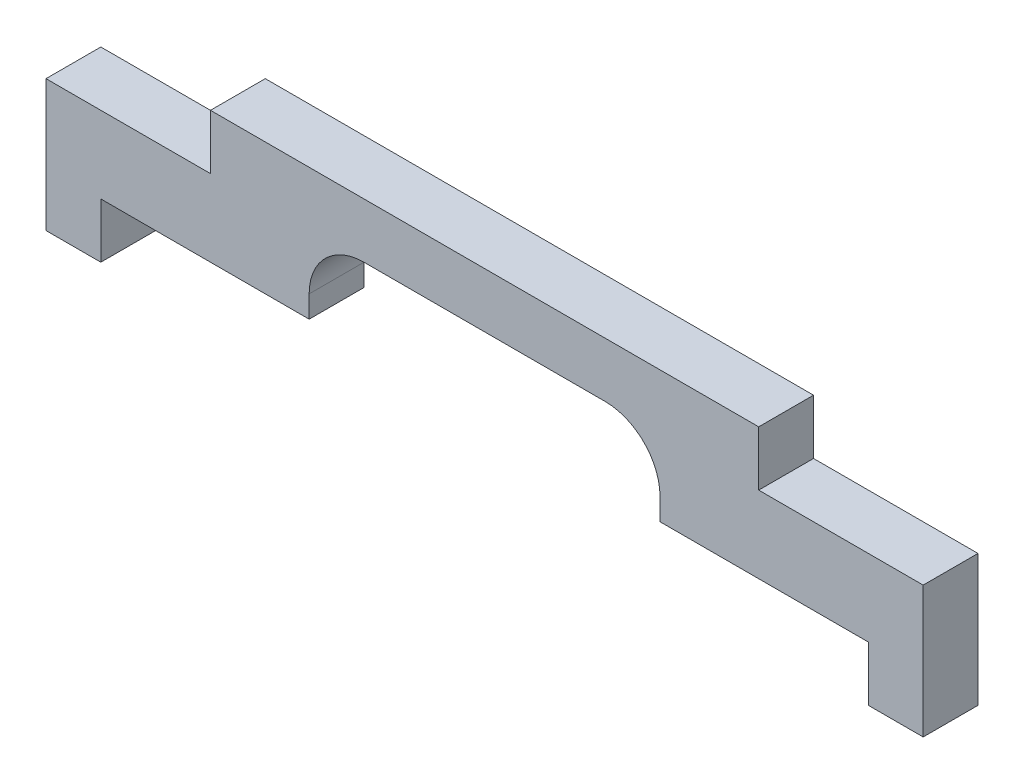
ISO-10303-21;
HEADER;
FILE_DESCRIPTION(('STEP AP214'),'2;1');
FILE_NAME('part.step','',(''),(''),'','','');
FILE_SCHEMA(('AUTOMOTIVE_DESIGN { 1 0 10303 214 1 1 1 1 }'));
ENDSEC;
DATA;
#1=APPLICATION_CONTEXT('core data for automotive mechanical design processes');
#2=APPLICATION_PROTOCOL_DEFINITION('international standard','automotive_design',2000,#1);
#3=PRODUCT_CONTEXT('',#1,'mechanical');
#4=PRODUCT('Part','Part','',(#3));
#5=PRODUCT_RELATED_PRODUCT_CATEGORY('part','',(#4));
#6=PRODUCT_DEFINITION_FORMATION('','',#4);
#7=PRODUCT_DEFINITION_CONTEXT('part definition',#1,'design');
#8=PRODUCT_DEFINITION('design','',#6,#7);
#9=PRODUCT_DEFINITION_SHAPE('','',#8);
#10=(LENGTH_UNIT() NAMED_UNIT(*) SI_UNIT(.MILLI.,.METRE.));
#11=(NAMED_UNIT(*) PLANE_ANGLE_UNIT() SI_UNIT($,.RADIAN.));
#12=(NAMED_UNIT(*) SI_UNIT($,.STERADIAN.) SOLID_ANGLE_UNIT());
#13=UNCERTAINTY_MEASURE_WITH_UNIT(LENGTH_MEASURE(1.E-05),#10,'distance_accuracy_value','');
#14=(GEOMETRIC_REPRESENTATION_CONTEXT(3) GLOBAL_UNCERTAINTY_ASSIGNED_CONTEXT((#13)) GLOBAL_UNIT_ASSIGNED_CONTEXT((#10,
#11,#12)) REPRESENTATION_CONTEXT('',''));
#15=CARTESIAN_POINT('',(0.,0.,0.));
#16=DIRECTION('',(0.,0.,1.));
#17=DIRECTION('',(1.,0.,0.));
#18=AXIS2_PLACEMENT_3D('',#15,#16,#17);
#19=CARTESIAN_POINT('',(-15.9999999999999,-12.,5.));
#20=DIRECTION('',(-1.,0.,0.));
#21=DIRECTION('',(0.,0.,1.));
#22=AXIS2_PLACEMENT_3D('',#19,#20,#21);
#23=PLANE('',#22);
#24=DIRECTION('',(0.,0.,1.));
#25=VECTOR('',#24,1.);
#26=CARTESIAN_POINT('',(-15.9999999999999,-10.,0.));
#27=LINE('',#26,#25);
#28=CARTESIAN_POINT('',(-15.9999999999999,-10.,0.));
#29=VERTEX_POINT('',#28);
#30=CARTESIAN_POINT('',(-15.9999999999999,-10.,5.));
#31=VERTEX_POINT('',#30);
#32=EDGE_CURVE('E174',#29,#31,#27,.T.);
#33=ORIENTED_EDGE('',*,*,#32,.T.);
#34=DIRECTION('',(0.,1.,0.));
#35=VECTOR('',#34,1.);
#36=CARTESIAN_POINT('',(-15.9999999999999,-12.,5.));
#37=LINE('',#36,#35);
#38=CARTESIAN_POINT('',(-15.9999999999999,-12.,5.));
#39=VERTEX_POINT('',#38);
#40=EDGE_CURVE('E207',#39,#31,#37,.T.);
#41=ORIENTED_EDGE('',*,*,#40,.F.);
#42=DIRECTION('',(0.,0.,-1.));
#43=VECTOR('',#42,1.);
#44=CARTESIAN_POINT('',(-15.9999999999999,-12.,5.));
#45=LINE('',#44,#43);
#46=CARTESIAN_POINT('',(-15.9999999999999,-12.,0.));
#47=VERTEX_POINT('',#46);
#48=EDGE_CURVE('E277',#39,#47,#45,.T.);
#49=ORIENTED_EDGE('',*,*,#48,.T.);
#50=DIRECTION('',(0.,1.,0.));
#51=VECTOR('',#50,1.);
#52=CARTESIAN_POINT('',(-15.9999999999999,-12.,0.));
#53=LINE('',#52,#51);
#54=EDGE_CURVE('E240',#47,#29,#53,.T.);
#55=ORIENTED_EDGE('',*,*,#54,.T.);
#56=EDGE_LOOP('',(#33,#41,#49,#55));
#57=FACE_BOUND('',#56,.T.);
#58=ADVANCED_FACE('F33',(#57),#23,.F.);
#59=CARTESIAN_POINT('',(15.9999999999999,-4.99999999999999,5.));
#60=DIRECTION('',(0.,1.,0.));
#61=DIRECTION('',(-1.,0.,0.));
#62=AXIS2_PLACEMENT_3D('',#59,#60,#61);
#63=PLANE('',#62);
#64=DIRECTION('',(1.,0.,0.));
#65=VECTOR('',#64,1.);
#66=CARTESIAN_POINT('',(15.9999999999999,-4.99999999999999,5.));
#67=LINE('',#66,#65);
#68=CARTESIAN_POINT('',(-10.9999999999999,-5.,5.));
#69=VERTEX_POINT('',#68);
#70=CARTESIAN_POINT('',(10.9999999999999,-4.99999999999999,5.));
#71=VERTEX_POINT('',#70);
#72=EDGE_CURVE('E210',#69,#71,#67,.T.);
#73=ORIENTED_EDGE('',*,*,#72,.F.);
#74=DIRECTION('',(0.,0.,1.));
#75=VECTOR('',#74,1.);
#76=CARTESIAN_POINT('',(-10.9999999999999,-5.,0.));
#77=LINE('',#76,#75);
#78=CARTESIAN_POINT('',(-10.9999999999999,-5.,0.));
#79=VERTEX_POINT('',#78);
#80=EDGE_CURVE('E177',#79,#69,#77,.T.);
#81=ORIENTED_EDGE('',*,*,#80,.F.);
#82=DIRECTION('',(1.,0.,0.));
#83=VECTOR('',#82,1.);
#84=CARTESIAN_POINT('',(15.9999999999999,-4.99999999999999,0.));
#85=LINE('',#84,#83);
#86=CARTESIAN_POINT('',(10.9999999999999,-4.99999999999999,0.));
#87=VERTEX_POINT('',#86);
#88=EDGE_CURVE('E167',#79,#87,#85,.T.);
#89=ORIENTED_EDGE('',*,*,#88,.T.);
#90=DIRECTION('',(0.,0.,1.));
#91=VECTOR('',#90,1.);
#92=CARTESIAN_POINT('',(10.9999999999999,-5.,0.));
#93=LINE('',#92,#91);
#94=EDGE_CURVE('E56',#87,#71,#93,.T.);
#95=ORIENTED_EDGE('',*,*,#94,.T.);
#96=EDGE_LOOP('',(#73,#81,#89,#95));
#97=FACE_BOUND('',#96,.T.);
#98=ADVANCED_FACE('F350',(#97),#63,.F.);
#99=CARTESIAN_POINT('',(-25.,0.,5.));
#100=DIRECTION('',(1.,0.,0.));
#101=DIRECTION('',(0.,0.,-1.));
#102=AXIS2_PLACEMENT_3D('',#99,#100,#101);
#103=PLANE('',#102);
#104=DIRECTION('',(0.,-1.,0.));
#105=VECTOR('',#104,1.);
#106=CARTESIAN_POINT('',(-25.,0.,0.));
#107=LINE('',#106,#105);
#108=CARTESIAN_POINT('',(-25.,0.,0.));
#109=VERTEX_POINT('',#108);
#110=CARTESIAN_POINT('',(-25.,-5.,0.));
#111=VERTEX_POINT('',#110);
#112=EDGE_CURVE('E190',#109,#111,#107,.T.);
#113=ORIENTED_EDGE('',*,*,#112,.T.);
#114=DIRECTION('',(0.,0.,-1.));
#115=VECTOR('',#114,1.);
#116=CARTESIAN_POINT('',(-25.,-5.,5.));
#117=LINE('',#116,#115);
#118=CARTESIAN_POINT('',(-25.,-5.,5.));
#119=VERTEX_POINT('',#118);
#120=EDGE_CURVE('E11',#119,#111,#117,.T.);
#121=ORIENTED_EDGE('',*,*,#120,.F.);
#122=DIRECTION('',(0.,-1.,0.));
#123=VECTOR('',#122,1.);
#124=CARTESIAN_POINT('',(-25.,0.,5.));
#125=LINE('',#124,#123);
#126=CARTESIAN_POINT('',(-25.,0.,5.));
#127=VERTEX_POINT('',#126);
#128=EDGE_CURVE('E193',#127,#119,#125,.T.);
#129=ORIENTED_EDGE('',*,*,#128,.F.);
#130=DIRECTION('',(0.,0.,-1.));
#131=VECTOR('',#130,1.);
#132=CARTESIAN_POINT('',(-25.,0.,5.));
#133=LINE('',#132,#131);
#134=EDGE_CURVE('E227',#127,#109,#133,.T.);
#135=ORIENTED_EDGE('',*,*,#134,.T.);
#136=EDGE_LOOP('',(#113,#121,#129,#135));
#137=FACE_BOUND('',#136,.T.);
#138=ADVANCED_FACE('F35',(#137),#103,.F.);
#139=CARTESIAN_POINT('',(-25.,-5.,5.));
#140=DIRECTION('',(0.,-1.,0.));
#141=DIRECTION('',(1.,0.,0.));
#142=AXIS2_PLACEMENT_3D('',#139,#140,#141);
#143=PLANE('',#142);
#144=DIRECTION('',(-1.,0.,0.));
#145=VECTOR('',#144,1.);
#146=CARTESIAN_POINT('',(-25.,-5.,0.));
#147=LINE('',#146,#145);
#148=CARTESIAN_POINT('',(-40.,-5.00000000000001,0.));
#149=VERTEX_POINT('',#148);
#150=EDGE_CURVE('E230',#111,#149,#147,.T.);
#151=ORIENTED_EDGE('',*,*,#150,.T.);
#152=DIRECTION('',(0.,0.,-1.));
#153=VECTOR('',#152,1.);
#154=CARTESIAN_POINT('',(-40.,-5.00000000000001,5.));
#155=LINE('',#154,#153);
#156=CARTESIAN_POINT('',(-40.,-5.00000000000001,5.));
#157=VERTEX_POINT('',#156);
#158=EDGE_CURVE('E41',#157,#149,#155,.T.);
#159=ORIENTED_EDGE('',*,*,#158,.F.);
#160=DIRECTION('',(-1.,0.,0.));
#161=VECTOR('',#160,1.);
#162=CARTESIAN_POINT('',(-25.,-5.,5.));
#163=LINE('',#162,#161);
#164=EDGE_CURVE('E196',#119,#157,#163,.T.);
#165=ORIENTED_EDGE('',*,*,#164,.F.);
#166=ORIENTED_EDGE('',*,*,#120,.T.);
#167=EDGE_LOOP('',(#151,#159,#165,#166));
#168=FACE_BOUND('',#167,.T.);
#169=ADVANCED_FACE('F314',(#168),#143,.F.);
#170=CARTESIAN_POINT('',(-40.,-5.00000000000001,5.));
#171=DIRECTION('',(1.,0.,0.));
#172=DIRECTION('',(0.,0.,-1.));
#173=AXIS2_PLACEMENT_3D('',#170,#171,#172);
#174=PLANE('',#173);
#175=DIRECTION('',(0.,-1.,0.));
#176=VECTOR('',#175,1.);
#177=CARTESIAN_POINT('',(-40.,-5.00000000000001,0.));
#178=LINE('',#177,#176);
#179=CARTESIAN_POINT('',(-40.,-17.0000000000002,0.));
#180=VERTEX_POINT('',#179);
#181=EDGE_CURVE('E232',#149,#180,#178,.T.);
#182=ORIENTED_EDGE('',*,*,#181,.T.);
#183=DIRECTION('',(0.,0.,-1.));
#184=VECTOR('',#183,1.);
#185=CARTESIAN_POINT('',(-40.,-17.0000000000002,5.));
#186=LINE('',#185,#184);
#187=CARTESIAN_POINT('',(-40.,-17.0000000000002,5.));
#188=VERTEX_POINT('',#187);
#189=EDGE_CURVE('E286',#188,#180,#186,.T.);
#190=ORIENTED_EDGE('',*,*,#189,.F.);
#191=DIRECTION('',(0.,-1.,0.));
#192=VECTOR('',#191,1.);
#193=CARTESIAN_POINT('',(-40.,-5.00000000000001,5.));
#194=LINE('',#193,#192);
#195=EDGE_CURVE('E199',#157,#188,#194,.T.);
#196=ORIENTED_EDGE('',*,*,#195,.F.);
#197=ORIENTED_EDGE('',*,*,#158,.T.);
#198=EDGE_LOOP('',(#182,#190,#196,#197));
#199=FACE_BOUND('',#198,.T.);
#200=ADVANCED_FACE('F293',(#199),#174,.F.);
#201=CARTESIAN_POINT('',(-40.,-17.0000000000002,5.));
#202=DIRECTION('',(0.,1.,0.));
#203=DIRECTION('',(-1.,0.,0.));
#204=AXIS2_PLACEMENT_3D('',#201,#202,#203);
#205=PLANE('',#204);
#206=DIRECTION('',(1.,0.,0.));
#207=VECTOR('',#206,1.);
#208=CARTESIAN_POINT('',(-40.,-17.0000000000002,0.));
#209=LINE('',#208,#207);
#210=CARTESIAN_POINT('',(-35.0000000000001,-17.0000000000002,0.));
#211=VERTEX_POINT('',#210);
#212=EDGE_CURVE('E234',#180,#211,#209,.T.);
#213=ORIENTED_EDGE('',*,*,#212,.T.);
#214=DIRECTION('',(0.,0.,-1.));
#215=VECTOR('',#214,1.);
#216=CARTESIAN_POINT('',(-35.0000000000001,-17.0000000000002,5.));
#217=LINE('',#216,#215);
#218=CARTESIAN_POINT('',(-35.0000000000001,-17.0000000000002,5.));
#219=VERTEX_POINT('',#218);
#220=EDGE_CURVE('E283',#219,#211,#217,.T.);
#221=ORIENTED_EDGE('',*,*,#220,.F.);
#222=DIRECTION('',(1.,0.,0.));
#223=VECTOR('',#222,1.);
#224=CARTESIAN_POINT('',(-40.,-17.0000000000002,5.));
#225=LINE('',#224,#223);
#226=EDGE_CURVE('E201',#188,#219,#225,.T.);
#227=ORIENTED_EDGE('',*,*,#226,.F.);
#228=ORIENTED_EDGE('',*,*,#189,.T.);
#229=EDGE_LOOP('',(#213,#221,#227,#228));
#230=FACE_BOUND('',#229,.T.);
#231=ADVANCED_FACE('F302',(#230),#205,.F.);
#232=CARTESIAN_POINT('',(-35.0000000000001,-17.0000000000002,5.));
#233=DIRECTION('',(-1.,0.,0.));
#234=DIRECTION('',(0.,0.,1.));
#235=AXIS2_PLACEMENT_3D('',#232,#233,#234);
#236=PLANE('',#235);
#237=DIRECTION('',(0.,1.,0.));
#238=VECTOR('',#237,1.);
#239=CARTESIAN_POINT('',(-35.0000000000001,-17.0000000000002,0.));
#240=LINE('',#239,#238);
#241=CARTESIAN_POINT('',(-35.0000000000001,-12.,0.));
#242=VERTEX_POINT('',#241);
#243=EDGE_CURVE('E236',#211,#242,#240,.T.);
#244=ORIENTED_EDGE('',*,*,#243,.T.);
#245=DIRECTION('',(0.,0.,-1.));
#246=VECTOR('',#245,1.);
#247=CARTESIAN_POINT('',(-35.0000000000001,-12.,5.));
#248=LINE('',#247,#246);
#249=CARTESIAN_POINT('',(-35.0000000000001,-12.,5.));
#250=VERTEX_POINT('',#249);
#251=EDGE_CURVE('E280',#250,#242,#248,.T.);
#252=ORIENTED_EDGE('',*,*,#251,.F.);
#253=DIRECTION('',(0.,1.,0.));
#254=VECTOR('',#253,1.);
#255=CARTESIAN_POINT('',(-35.0000000000001,-17.0000000000002,5.));
#256=LINE('',#255,#254);
#257=EDGE_CURVE('E203',#219,#250,#256,.T.);
#258=ORIENTED_EDGE('',*,*,#257,.F.);
#259=ORIENTED_EDGE('',*,*,#220,.T.);
#260=EDGE_LOOP('',(#244,#252,#258,#259));
#261=FACE_BOUND('',#260,.T.);
#262=ADVANCED_FACE('F306',(#261),#236,.F.);
#263=CARTESIAN_POINT('',(-35.0000000000001,-12.,5.));
#264=DIRECTION('',(0.,1.,0.));
#265=DIRECTION('',(-1.,0.,0.));
#266=AXIS2_PLACEMENT_3D('',#263,#264,#265);
#267=PLANE('',#266);
#268=DIRECTION('',(1.,0.,0.));
#269=VECTOR('',#268,1.);
#270=CARTESIAN_POINT('',(-35.0000000000001,-12.,0.));
#271=LINE('',#270,#269);
#272=EDGE_CURVE('E238',#242,#47,#271,.T.);
#273=ORIENTED_EDGE('',*,*,#272,.T.);
#274=ORIENTED_EDGE('',*,*,#48,.F.);
#275=DIRECTION('',(1.,0.,0.));
#276=VECTOR('',#275,1.);
#277=CARTESIAN_POINT('',(-35.0000000000001,-12.,5.));
#278=LINE('',#277,#276);
#279=EDGE_CURVE('E205',#250,#39,#278,.T.);
#280=ORIENTED_EDGE('',*,*,#279,.F.);
#281=ORIENTED_EDGE('',*,*,#251,.T.);
#282=EDGE_LOOP('',(#273,#274,#280,#281));
#283=FACE_BOUND('',#282,.T.);
#284=ADVANCED_FACE('F359',(#283),#267,.F.);
#285=CARTESIAN_POINT('',(15.9999999999999,-12.,5.));
#286=DIRECTION('',(1.,0.,0.));
#287=DIRECTION('',(0.,0.,-1.));
#288=AXIS2_PLACEMENT_3D('',#285,#286,#287);
#289=PLANE('',#288);
#290=DIRECTION('',(0.,-1.,0.));
#291=VECTOR('',#290,1.);
#292=CARTESIAN_POINT('',(15.9999999999999,-12.,5.));
#293=LINE('',#292,#291);
#294=CARTESIAN_POINT('',(15.9999999999999,-9.99999999999999,5.));
#295=VERTEX_POINT('',#294);
#296=CARTESIAN_POINT('',(15.9999999999999,-12.,5.));
#297=VERTEX_POINT('',#296);
#298=EDGE_CURVE('E48',#295,#297,#293,.T.);
#299=ORIENTED_EDGE('',*,*,#298,.F.);
#300=DIRECTION('',(0.,0.,1.));
#301=VECTOR('',#300,1.);
#302=CARTESIAN_POINT('',(15.9999999999999,-9.99999999999999,0.));
#303=LINE('',#302,#301);
#304=CARTESIAN_POINT('',(15.9999999999999,-9.99999999999999,0.));
#305=VERTEX_POINT('',#304);
#306=EDGE_CURVE('E169',#305,#295,#303,.T.);
#307=ORIENTED_EDGE('',*,*,#306,.F.);
#308=DIRECTION('',(0.,-1.,0.));
#309=VECTOR('',#308,1.);
#310=CARTESIAN_POINT('',(15.9999999999999,-12.,0.));
#311=LINE('',#310,#309);
#312=CARTESIAN_POINT('',(15.9999999999999,-12.,0.));
#313=VERTEX_POINT('',#312);
#314=EDGE_CURVE('E159',#305,#313,#311,.T.);
#315=ORIENTED_EDGE('',*,*,#314,.T.);
#316=DIRECTION('',(0.,0.,-1.));
#317=VECTOR('',#316,1.);
#318=CARTESIAN_POINT('',(15.9999999999999,-12.,5.));
#319=LINE('',#318,#317);
#320=EDGE_CURVE('E275',#297,#313,#319,.T.);
#321=ORIENTED_EDGE('',*,*,#320,.F.);
#322=EDGE_LOOP('',(#299,#307,#315,#321));
#323=FACE_BOUND('',#322,.T.);
#324=ADVANCED_FACE('F170',(#323),#289,.F.);
#325=CARTESIAN_POINT('',(35.0000000000001,-12.,5.));
#326=DIRECTION('',(0.,1.,0.));
#327=DIRECTION('',(-1.,0.,0.));
#328=AXIS2_PLACEMENT_3D('',#325,#326,#327);
#329=PLANE('',#328);
#330=DIRECTION('',(1.,0.,0.));
#331=VECTOR('',#330,1.);
#332=CARTESIAN_POINT('',(35.0000000000001,-12.,0.));
#333=LINE('',#332,#331);
#334=CARTESIAN_POINT('',(35.0000000000001,-12.,0.));
#335=VERTEX_POINT('',#334);
#336=EDGE_CURVE('E165',#313,#335,#333,.T.);
#337=ORIENTED_EDGE('',*,*,#336,.T.);
#338=DIRECTION('',(0.,0.,-1.));
#339=VECTOR('',#338,1.);
#340=CARTESIAN_POINT('',(35.0000000000001,-12.,5.));
#341=LINE('',#340,#339);
#342=CARTESIAN_POINT('',(35.0000000000001,-12.,5.));
#343=VERTEX_POINT('',#342);
#344=EDGE_CURVE('E272',#343,#335,#341,.T.);
#345=ORIENTED_EDGE('',*,*,#344,.F.);
#346=DIRECTION('',(1.,0.,0.));
#347=VECTOR('',#346,1.);
#348=CARTESIAN_POINT('',(35.0000000000001,-12.,5.));
#349=LINE('',#348,#347);
#350=EDGE_CURVE('E213',#297,#343,#349,.T.);
#351=ORIENTED_EDGE('',*,*,#350,.F.);
#352=ORIENTED_EDGE('',*,*,#320,.T.);
#353=EDGE_LOOP('',(#337,#345,#351,#352));
#354=FACE_BOUND('',#353,.T.);
#355=ADVANCED_FACE('F348',(#354),#329,.F.);
#356=CARTESIAN_POINT('',(35.0000000000001,-17.0000000000001,5.));
#357=DIRECTION('',(1.,0.,0.));
#358=DIRECTION('',(0.,0.,-1.));
#359=AXIS2_PLACEMENT_3D('',#356,#357,#358);
#360=PLANE('',#359);
#361=DIRECTION('',(0.,-1.,0.));
#362=VECTOR('',#361,1.);
#363=CARTESIAN_POINT('',(35.0000000000001,-17.0000000000001,0.));
#364=LINE('',#363,#362);
#365=CARTESIAN_POINT('',(35.0000000000001,-17.0000000000001,0.));
#366=VERTEX_POINT('',#365);
#367=EDGE_CURVE('E244',#335,#366,#364,.T.);
#368=ORIENTED_EDGE('',*,*,#367,.T.);
#369=DIRECTION('',(0.,0.,-1.));
#370=VECTOR('',#369,1.);
#371=CARTESIAN_POINT('',(35.0000000000001,-17.0000000000001,5.));
#372=LINE('',#371,#370);
#373=CARTESIAN_POINT('',(35.0000000000001,-17.0000000000001,5.));
#374=VERTEX_POINT('',#373);
#375=EDGE_CURVE('E269',#374,#366,#372,.T.);
#376=ORIENTED_EDGE('',*,*,#375,.F.);
#377=DIRECTION('',(0.,-1.,0.));
#378=VECTOR('',#377,1.);
#379=CARTESIAN_POINT('',(35.0000000000001,-17.0000000000001,5.));
#380=LINE('',#379,#378);
#381=EDGE_CURVE('E215',#343,#374,#380,.T.);
#382=ORIENTED_EDGE('',*,*,#381,.F.);
#383=ORIENTED_EDGE('',*,*,#344,.T.);
#384=EDGE_LOOP('',(#368,#376,#382,#383));
#385=FACE_BOUND('',#384,.T.);
#386=ADVANCED_FACE('F344',(#385),#360,.F.);
#387=CARTESIAN_POINT('',(40.,-17.0000000000001,5.));
#388=DIRECTION('',(0.,1.,0.));
#389=DIRECTION('',(0.,0.,1.));
#390=AXIS2_PLACEMENT_3D('',#387,#388,#389);
#391=PLANE('',#390);
#392=DIRECTION('',(1.,0.,0.));
#393=VECTOR('',#392,1.);
#394=CARTESIAN_POINT('',(40.,-17.0000000000001,0.));
#395=LINE('',#394,#393);
#396=CARTESIAN_POINT('',(40.,-17.0000000000001,0.));
#397=VERTEX_POINT('',#396);
#398=EDGE_CURVE('E246',#366,#397,#395,.T.);
#399=ORIENTED_EDGE('',*,*,#398,.T.);
#400=DIRECTION('',(0.,0.,-1.));
#401=VECTOR('',#400,1.);
#402=CARTESIAN_POINT('',(40.,-17.0000000000001,5.));
#403=LINE('',#402,#401);
#404=CARTESIAN_POINT('',(40.,-17.0000000000001,5.));
#405=VERTEX_POINT('',#404);
#406=EDGE_CURVE('E266',#405,#397,#403,.T.);
#407=ORIENTED_EDGE('',*,*,#406,.F.);
#408=DIRECTION('',(1.,0.,0.));
#409=VECTOR('',#408,1.);
#410=CARTESIAN_POINT('',(40.,-17.0000000000001,5.));
#411=LINE('',#410,#409);
#412=EDGE_CURVE('E217',#374,#405,#411,.T.);
#413=ORIENTED_EDGE('',*,*,#412,.F.);
#414=ORIENTED_EDGE('',*,*,#375,.T.);
#415=EDGE_LOOP('',(#399,#407,#413,#414));
#416=FACE_BOUND('',#415,.T.);
#417=ADVANCED_FACE('F340',(#416),#391,.F.);
#418=CARTESIAN_POINT('',(40.,-5.,5.));
#419=DIRECTION('',(-1.,0.,0.));
#420=DIRECTION('',(0.,0.,1.));
#421=AXIS2_PLACEMENT_3D('',#418,#419,#420);
#422=PLANE('',#421);
#423=DIRECTION('',(0.,1.,0.));
#424=VECTOR('',#423,1.);
#425=CARTESIAN_POINT('',(40.,-5.,0.));
#426=LINE('',#425,#424);
#427=CARTESIAN_POINT('',(40.,-5.,0.));
#428=VERTEX_POINT('',#427);
#429=EDGE_CURVE('E248',#397,#428,#426,.T.);
#430=ORIENTED_EDGE('',*,*,#429,.T.);
#431=DIRECTION('',(0.,0.,-1.));
#432=VECTOR('',#431,1.);
#433=CARTESIAN_POINT('',(40.,-5.,5.));
#434=LINE('',#433,#432);
#435=CARTESIAN_POINT('',(40.,-5.,5.));
#436=VERTEX_POINT('',#435);
#437=EDGE_CURVE('E263',#436,#428,#434,.T.);
#438=ORIENTED_EDGE('',*,*,#437,.F.);
#439=DIRECTION('',(0.,1.,0.));
#440=VECTOR('',#439,1.);
#441=CARTESIAN_POINT('',(40.,-5.,5.));
#442=LINE('',#441,#440);
#443=EDGE_CURVE('E219',#405,#436,#442,.T.);
#444=ORIENTED_EDGE('',*,*,#443,.F.);
#445=ORIENTED_EDGE('',*,*,#406,.T.);
#446=EDGE_LOOP('',(#430,#438,#444,#445));
#447=FACE_BOUND('',#446,.T.);
#448=ADVANCED_FACE('F335',(#447),#422,.F.);
#449=CARTESIAN_POINT('',(25.,-5.,5.));
#450=DIRECTION('',(0.,-1.,0.));
#451=DIRECTION('',(1.,0.,0.));
#452=AXIS2_PLACEMENT_3D('',#449,#450,#451);
#453=PLANE('',#452);
#454=DIRECTION('',(-1.,0.,0.));
#455=VECTOR('',#454,1.);
#456=CARTESIAN_POINT('',(25.,-5.,0.));
#457=LINE('',#456,#455);
#458=CARTESIAN_POINT('',(25.,-5.,0.));
#459=VERTEX_POINT('',#458);
#460=EDGE_CURVE('E250',#428,#459,#457,.T.);
#461=ORIENTED_EDGE('',*,*,#460,.T.);
#462=DIRECTION('',(0.,0.,-1.));
#463=VECTOR('',#462,1.);
#464=CARTESIAN_POINT('',(25.,-5.,5.));
#465=LINE('',#464,#463);
#466=CARTESIAN_POINT('',(25.,-5.,5.));
#467=VERTEX_POINT('',#466);
#468=EDGE_CURVE('E260',#467,#459,#465,.T.);
#469=ORIENTED_EDGE('',*,*,#468,.F.);
#470=DIRECTION('',(-1.,0.,0.));
#471=VECTOR('',#470,1.);
#472=CARTESIAN_POINT('',(25.,-5.,5.));
#473=LINE('',#472,#471);
#474=EDGE_CURVE('E221',#436,#467,#473,.T.);
#475=ORIENTED_EDGE('',*,*,#474,.F.);
#476=ORIENTED_EDGE('',*,*,#437,.T.);
#477=EDGE_LOOP('',(#461,#469,#475,#476));
#478=FACE_BOUND('',#477,.T.);
#479=ADVANCED_FACE('F330',(#478),#453,.F.);
#480=CARTESIAN_POINT('',(25.,0.,5.));
#481=DIRECTION('',(-1.,0.,0.));
#482=DIRECTION('',(0.,0.,1.));
#483=AXIS2_PLACEMENT_3D('',#480,#481,#482);
#484=PLANE('',#483);
#485=DIRECTION('',(0.,1.,0.));
#486=VECTOR('',#485,1.);
#487=CARTESIAN_POINT('',(25.,0.,0.));
#488=LINE('',#487,#486);
#489=CARTESIAN_POINT('',(25.,0.,0.));
#490=VERTEX_POINT('',#489);
#491=EDGE_CURVE('E252',#459,#490,#488,.T.);
#492=ORIENTED_EDGE('',*,*,#491,.T.);
#493=DIRECTION('',(0.,0.,-1.));
#494=VECTOR('',#493,1.);
#495=CARTESIAN_POINT('',(25.,0.,5.));
#496=LINE('',#495,#494);
#497=CARTESIAN_POINT('',(25.,0.,5.));
#498=VERTEX_POINT('',#497);
#499=EDGE_CURVE('E257',#498,#490,#496,.T.);
#500=ORIENTED_EDGE('',*,*,#499,.F.);
#501=DIRECTION('',(0.,1.,0.));
#502=VECTOR('',#501,1.);
#503=CARTESIAN_POINT('',(25.,0.,5.));
#504=LINE('',#503,#502);
#505=EDGE_CURVE('E223',#467,#498,#504,.T.);
#506=ORIENTED_EDGE('',*,*,#505,.F.);
#507=ORIENTED_EDGE('',*,*,#468,.T.);
#508=EDGE_LOOP('',(#492,#500,#506,#507));
#509=FACE_BOUND('',#508,.T.);
#510=ADVANCED_FACE('F326',(#509),#484,.F.);
#511=CARTESIAN_POINT('',(-25.,0.,5.));
#512=DIRECTION('',(0.,-1.,0.));
#513=DIRECTION('',(1.,0.,0.));
#514=AXIS2_PLACEMENT_3D('',#511,#512,#513);
#515=PLANE('',#514);
#516=DIRECTION('',(-1.,0.,0.));
#517=VECTOR('',#516,1.);
#518=CARTESIAN_POINT('',(-25.,0.,0.));
#519=LINE('',#518,#517);
#520=EDGE_CURVE('E197',#490,#109,#519,.T.);
#521=ORIENTED_EDGE('',*,*,#520,.T.);
#522=ORIENTED_EDGE('',*,*,#134,.F.);
#523=DIRECTION('',(-1.,0.,0.));
#524=VECTOR('',#523,1.);
#525=CARTESIAN_POINT('',(-25.,0.,5.));
#526=LINE('',#525,#524);
#527=EDGE_CURVE('E225',#498,#127,#526,.T.);
#528=ORIENTED_EDGE('',*,*,#527,.F.);
#529=ORIENTED_EDGE('',*,*,#499,.T.);
#530=EDGE_LOOP('',(#521,#522,#528,#529));
#531=FACE_BOUND('',#530,.T.);
#532=ADVANCED_FACE('F321',(#531),#515,.F.);
#533=CARTESIAN_POINT('',(0.,0.,5.));
#534=DIRECTION('',(0.,0.,-1.));
#535=DIRECTION('',(-1.,0.,0.));
#536=AXIS2_PLACEMENT_3D('',#533,#534,#535);
#537=PLANE('',#536);
#538=CARTESIAN_POINT('',(-10.9999999999999,-10.,5.));
#539=DIRECTION('',(0.,0.,-1.));
#540=DIRECTION('',(-1.,0.,0.));
#541=AXIS2_PLACEMENT_3D('',#538,#539,#540);
#542=CIRCLE('',#541,5.);
#543=EDGE_CURVE('E186',#31,#69,#542,.T.);
#544=ORIENTED_EDGE('',*,*,#543,.T.);
#545=ORIENTED_EDGE('',*,*,#72,.T.);
#546=CARTESIAN_POINT('',(10.9999999999999,-9.99999999999999,5.));
#547=DIRECTION('',(0.,0.,-1.));
#548=DIRECTION('',(1.,0.,0.));
#549=AXIS2_PLACEMENT_3D('',#546,#547,#548);
#550=CIRCLE('',#549,5.);
#551=EDGE_CURVE('E183',#71,#295,#550,.T.);
#552=ORIENTED_EDGE('',*,*,#551,.T.);
#553=ORIENTED_EDGE('',*,*,#298,.T.);
#554=ORIENTED_EDGE('',*,*,#350,.T.);
#555=ORIENTED_EDGE('',*,*,#381,.T.);
#556=ORIENTED_EDGE('',*,*,#412,.T.);
#557=ORIENTED_EDGE('',*,*,#443,.T.);
#558=ORIENTED_EDGE('',*,*,#474,.T.);
#559=ORIENTED_EDGE('',*,*,#505,.T.);
#560=ORIENTED_EDGE('',*,*,#527,.T.);
#561=ORIENTED_EDGE('',*,*,#128,.T.);
#562=ORIENTED_EDGE('',*,*,#164,.T.);
#563=ORIENTED_EDGE('',*,*,#195,.T.);
#564=ORIENTED_EDGE('',*,*,#226,.T.);
#565=ORIENTED_EDGE('',*,*,#257,.T.);
#566=ORIENTED_EDGE('',*,*,#279,.T.);
#567=ORIENTED_EDGE('',*,*,#40,.T.);
#568=EDGE_LOOP('',(#544,#545,#552,#553,#554,#555,#556,#557,#558,#559,#560,#561,#562,#563,#564,
#565,#566,#567));
#569=FACE_BOUND('',#568,.T.);
#570=ADVANCED_FACE('F310',(#569),#537,.F.);
#571=CARTESIAN_POINT('',(0.,0.,0.));
#572=DIRECTION('',(0.,0.,-1.));
#573=DIRECTION('',(-1.,0.,0.));
#574=AXIS2_PLACEMENT_3D('',#571,#572,#573);
#575=PLANE('',#574);
#576=ORIENTED_EDGE('',*,*,#88,.F.);
#577=CARTESIAN_POINT('',(-10.9999999999999,-10.,0.));
#578=DIRECTION('',(0.,0.,-1.));
#579=DIRECTION('',(-1.,0.,0.));
#580=AXIS2_PLACEMENT_3D('',#577,#578,#579);
#581=CIRCLE('',#580,5.);
#582=EDGE_CURVE('E178',#29,#79,#581,.T.);
#583=ORIENTED_EDGE('',*,*,#582,.F.);
#584=ORIENTED_EDGE('',*,*,#54,.F.);
#585=ORIENTED_EDGE('',*,*,#272,.F.);
#586=ORIENTED_EDGE('',*,*,#243,.F.);
#587=ORIENTED_EDGE('',*,*,#212,.F.);
#588=ORIENTED_EDGE('',*,*,#181,.F.);
#589=ORIENTED_EDGE('',*,*,#150,.F.);
#590=ORIENTED_EDGE('',*,*,#112,.F.);
#591=ORIENTED_EDGE('',*,*,#520,.F.);
#592=ORIENTED_EDGE('',*,*,#491,.F.);
#593=ORIENTED_EDGE('',*,*,#460,.F.);
#594=ORIENTED_EDGE('',*,*,#429,.F.);
#595=ORIENTED_EDGE('',*,*,#398,.F.);
#596=ORIENTED_EDGE('',*,*,#367,.F.);
#597=ORIENTED_EDGE('',*,*,#336,.F.);
#598=ORIENTED_EDGE('',*,*,#314,.F.);
#599=CARTESIAN_POINT('',(10.9999999999999,-9.99999999999999,0.));
#600=DIRECTION('',(0.,0.,-1.));
#601=DIRECTION('',(1.,0.,0.));
#602=AXIS2_PLACEMENT_3D('',#599,#600,#601);
#603=CIRCLE('',#602,5.);
#604=EDGE_CURVE('E163',#87,#305,#603,.T.);
#605=ORIENTED_EDGE('',*,*,#604,.F.);
#606=EDGE_LOOP('',(#576,#583,#584,#585,#586,#587,#588,#589,#590,#591,#592,#593,#594,#595,#596,
#597,#598,#605));
#607=FACE_BOUND('',#606,.T.);
#608=ADVANCED_FACE('F161',(#607),#575,.T.);
#609=CARTESIAN_POINT('',(10.9999999999999,-9.99999999999999,0.));
#610=DIRECTION('',(0.,0.,1.));
#611=DIRECTION('',(1.,0.,0.));
#612=AXIS2_PLACEMENT_3D('',#609,#610,#611);
#613=CYLINDRICAL_SURFACE('',#612,5.);
#614=ORIENTED_EDGE('',*,*,#551,.F.);
#615=ORIENTED_EDGE('',*,*,#94,.F.);
#616=ORIENTED_EDGE('',*,*,#604,.T.);
#617=ORIENTED_EDGE('',*,*,#306,.T.);
#618=EDGE_LOOP('',(#614,#615,#616,#617));
#619=FACE_BOUND('',#618,.T.);
#620=ADVANCED_FACE('F176',(#619),#613,.F.);
#621=CARTESIAN_POINT('',(-10.9999999999999,-10.,0.));
#622=DIRECTION('',(0.,0.,1.));
#623=DIRECTION('',(1.,0.,0.));
#624=AXIS2_PLACEMENT_3D('',#621,#622,#623);
#625=CYLINDRICAL_SURFACE('',#624,5.);
#626=ORIENTED_EDGE('',*,*,#543,.F.);
#627=ORIENTED_EDGE('',*,*,#32,.F.);
#628=ORIENTED_EDGE('',*,*,#582,.T.);
#629=ORIENTED_EDGE('',*,*,#80,.T.);
#630=EDGE_LOOP('',(#626,#627,#628,#629));
#631=FACE_BOUND('',#630,.T.);
#632=ADVANCED_FACE('F352',(#631),#625,.F.);
#633=CLOSED_SHELL('',(#58,#98,#138,#169,#200,#231,#262,#284,#324,#355,#386,#417,#448,#479,#510,
#532,#570,#608,#620,#632));
#634=MANIFOLD_SOLID_BREP('B2',#633);
#635=ADVANCED_BREP_SHAPE_REPRESENTATION('',(#18,#634),#14);
#636=SHAPE_DEFINITION_REPRESENTATION(#9,#635);
ENDSEC;
END-ISO-10303-21;
